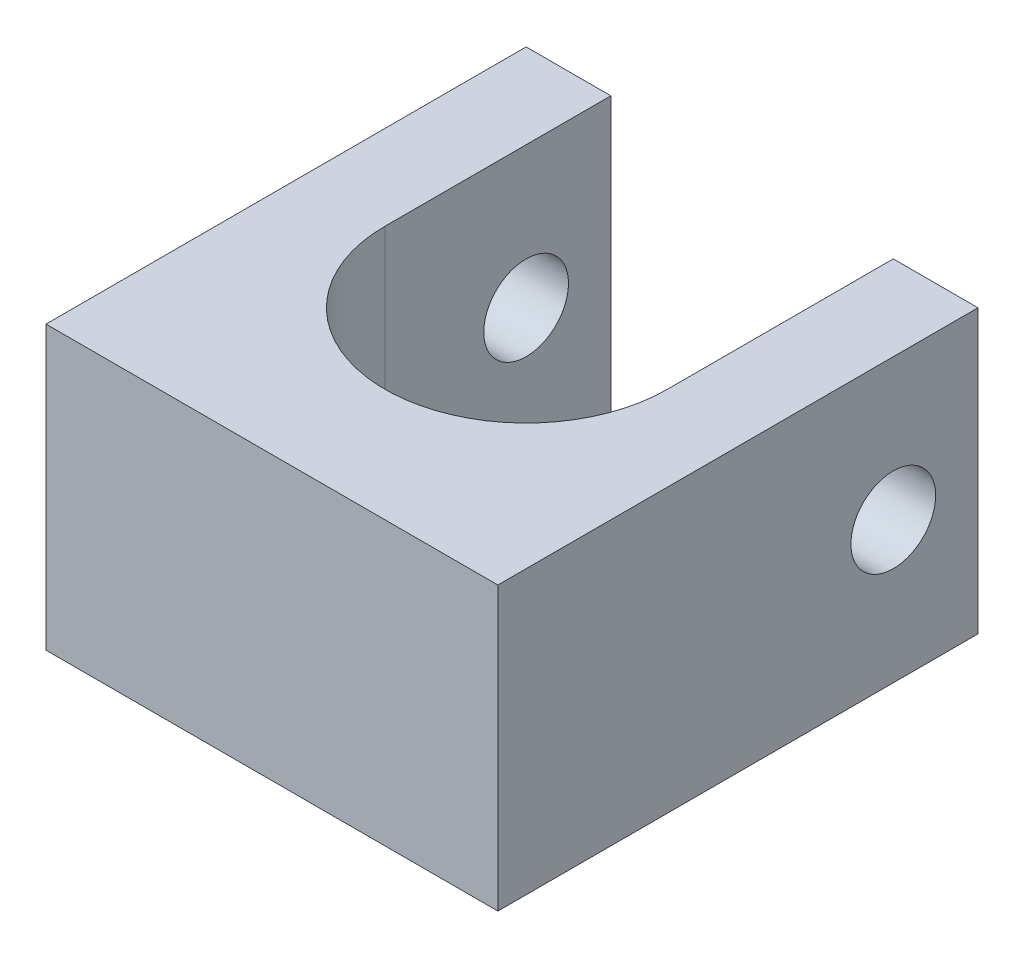
ISO-10303-21;
HEADER;
FILE_DESCRIPTION(('STEP AP214'),'2;1');
FILE_NAME('part.step','',(''),(''),'','','');
FILE_SCHEMA(('AUTOMOTIVE_DESIGN { 1 0 10303 214 1 1 1 1 }'));
ENDSEC;
DATA;
#1=APPLICATION_CONTEXT('core data for automotive mechanical design processes');
#2=APPLICATION_PROTOCOL_DEFINITION('international standard','automotive_design',2000,#1);
#3=PRODUCT_CONTEXT('',#1,'mechanical');
#4=PRODUCT('Part','Part','',(#3));
#5=PRODUCT_RELATED_PRODUCT_CATEGORY('part','',(#4));
#6=PRODUCT_DEFINITION_FORMATION('','',#4);
#7=PRODUCT_DEFINITION_CONTEXT('part definition',#1,'design');
#8=PRODUCT_DEFINITION('design','',#6,#7);
#9=PRODUCT_DEFINITION_SHAPE('','',#8);
#10=(LENGTH_UNIT() NAMED_UNIT(*) SI_UNIT(.MILLI.,.METRE.));
#11=(NAMED_UNIT(*) PLANE_ANGLE_UNIT() SI_UNIT($,.RADIAN.));
#12=(NAMED_UNIT(*) SI_UNIT($,.STERADIAN.) SOLID_ANGLE_UNIT());
#13=UNCERTAINTY_MEASURE_WITH_UNIT(LENGTH_MEASURE(1.E-05),#10,'distance_accuracy_value','');
#14=(GEOMETRIC_REPRESENTATION_CONTEXT(3) GLOBAL_UNCERTAINTY_ASSIGNED_CONTEXT((#13)) GLOBAL_UNIT_ASSIGNED_CONTEXT((#10,
#11,#12)) REPRESENTATION_CONTEXT('',''));
#15=CARTESIAN_POINT('',(0.,0.,0.));
#16=DIRECTION('',(0.,0.,1.));
#17=DIRECTION('',(1.,0.,0.));
#18=AXIS2_PLACEMENT_3D('',#15,#16,#17);
#19=CARTESIAN_POINT('',(0.,0.,0.));
#20=DIRECTION('',(0.,0.,-1.));
#21=DIRECTION('',(-1.,0.,0.));
#22=AXIS2_PLACEMENT_3D('',#19,#20,#21);
#23=PLANE('',#22);
#24=DIRECTION('',(0.,1.,0.));
#25=VECTOR('',#24,1.);
#26=CARTESIAN_POINT('',(-25.,0.,0.));
#27=LINE('',#26,#25);
#28=CARTESIAN_POINT('',(-25.,-25.,0.));
#29=VERTEX_POINT('',#28);
#30=CARTESIAN_POINT('',(-25.,25.,0.));
#31=VERTEX_POINT('',#30);
#32=EDGE_CURVE('E11',#29,#31,#27,.T.);
#33=ORIENTED_EDGE('',*,*,#32,.F.);
#34=DIRECTION('',(1.,0.,0.));
#35=VECTOR('',#34,1.);
#36=CARTESIAN_POINT('',(-40.,-25.,0.));
#37=LINE('',#36,#35);
#38=CARTESIAN_POINT('',(-40.,-25.,0.));
#39=VERTEX_POINT('',#38);
#40=EDGE_CURVE('E136',#39,#29,#37,.T.);
#41=ORIENTED_EDGE('',*,*,#40,.F.);
#42=DIRECTION('',(0.,-1.,0.));
#43=VECTOR('',#42,1.);
#44=CARTESIAN_POINT('',(-40.,-25.,0.));
#45=LINE('',#44,#43);
#46=CARTESIAN_POINT('',(-40.,25.,0.));
#47=VERTEX_POINT('',#46);
#48=EDGE_CURVE('E148',#47,#39,#45,.T.);
#49=ORIENTED_EDGE('',*,*,#48,.F.);
#50=DIRECTION('',(-1.,0.,0.));
#51=VECTOR('',#50,1.);
#52=CARTESIAN_POINT('',(-40.,25.,0.));
#53=LINE('',#52,#51);
#54=EDGE_CURVE('E144',#31,#47,#53,.T.);
#55=ORIENTED_EDGE('',*,*,#54,.F.);
#56=EDGE_LOOP('',(#33,#41,#49,#55));
#57=FACE_BOUND('',#56,.T.);
#58=ADVANCED_FACE('F33',(#57),#23,.T.);
#59=CARTESIAN_POINT('',(40.,-25.,85.));
#60=DIRECTION('',(-1.,0.,0.));
#61=DIRECTION('',(0.,0.,1.));
#62=AXIS2_PLACEMENT_3D('',#59,#60,#61);
#63=PLANE('',#62);
#64=CARTESIAN_POINT('',(40.,0.,15.));
#65=DIRECTION('',(1.,0.,0.));
#66=DIRECTION('',(0.,0.,-1.));
#67=AXIS2_PLACEMENT_3D('',#64,#65,#66);
#68=CIRCLE('',#67,7.5);
#69=CARTESIAN_POINT('',(40.,0.,7.5));
#70=VERTEX_POINT('',#69);
#71=EDGE_CURVE('E122',#70,#70,#68,.T.);
#72=ORIENTED_EDGE('',*,*,#71,.F.);
#73=EDGE_LOOP('',(#72));
#74=FACE_BOUND('',#73,.T.);
#75=DIRECTION('',(0.,1.,0.));
#76=VECTOR('',#75,1.);
#77=CARTESIAN_POINT('',(40.,-25.,0.));
#78=LINE('',#77,#76);
#79=CARTESIAN_POINT('',(40.,-25.,0.));
#80=VERTEX_POINT('',#79);
#81=CARTESIAN_POINT('',(40.,25.,0.));
#82=VERTEX_POINT('',#81);
#83=EDGE_CURVE('E133',#80,#82,#78,.T.);
#84=ORIENTED_EDGE('',*,*,#83,.T.);
#85=DIRECTION('',(0.,0.,-1.));
#86=VECTOR('',#85,1.);
#87=CARTESIAN_POINT('',(40.,25.,85.));
#88=LINE('',#87,#86);
#89=CARTESIAN_POINT('',(40.,25.,85.));
#90=VERTEX_POINT('',#89);
#91=EDGE_CURVE('E158',#90,#82,#88,.T.);
#92=ORIENTED_EDGE('',*,*,#91,.F.);
#93=DIRECTION('',(0.,1.,0.));
#94=VECTOR('',#93,1.);
#95=CARTESIAN_POINT('',(40.,-25.,85.));
#96=LINE('',#95,#94);
#97=CARTESIAN_POINT('',(40.,-25.,85.));
#98=VERTEX_POINT('',#97);
#99=EDGE_CURVE('E134',#98,#90,#96,.T.);
#100=ORIENTED_EDGE('',*,*,#99,.F.);
#101=DIRECTION('',(0.,0.,-1.));
#102=VECTOR('',#101,1.);
#103=CARTESIAN_POINT('',(40.,-25.,85.));
#104=LINE('',#103,#102);
#105=EDGE_CURVE('E141',#98,#80,#104,.T.);
#106=ORIENTED_EDGE('',*,*,#105,.T.);
#107=EDGE_LOOP('',(#84,#92,#100,#106));
#108=FACE_BOUND('',#107,.T.);
#109=ADVANCED_FACE('F35',(#74,#108),#63,.F.);
#110=CARTESIAN_POINT('',(-40.,25.,85.));
#111=DIRECTION('',(0.,-1.,0.));
#112=DIRECTION('',(0.,0.,-1.));
#113=AXIS2_PLACEMENT_3D('',#110,#111,#112);
#114=PLANE('',#113);
#115=DIRECTION('',(0.,0.,1.));
#116=VECTOR('',#115,1.);
#117=CARTESIAN_POINT('',(25.,25.,85.));
#118=LINE('',#117,#116);
#119=CARTESIAN_POINT('',(25.,25.,0.));
#120=VERTEX_POINT('',#119);
#121=CARTESIAN_POINT('',(25.,25.,40.));
#122=VERTEX_POINT('',#121);
#123=EDGE_CURVE('E49',#120,#122,#118,.T.);
#124=ORIENTED_EDGE('',*,*,#123,.T.);
#125=CARTESIAN_POINT('',(0.,25.,40.));
#126=DIRECTION('',(0.,1.,0.));
#127=DIRECTION('',(0.,0.,1.));
#128=AXIS2_PLACEMENT_3D('',#125,#126,#127);
#129=CIRCLE('',#128,25.);
#130=CARTESIAN_POINT('',(-25.,25.,40.));
#131=VERTEX_POINT('',#130);
#132=EDGE_CURVE('E113',#131,#122,#129,.T.);
#133=ORIENTED_EDGE('',*,*,#132,.F.);
#134=DIRECTION('',(0.,0.,-1.));
#135=VECTOR('',#134,1.);
#136=CARTESIAN_POINT('',(-25.,25.,85.));
#137=LINE('',#136,#135);
#138=EDGE_CURVE('E130',#131,#31,#137,.T.);
#139=ORIENTED_EDGE('',*,*,#138,.T.);
#140=ORIENTED_EDGE('',*,*,#54,.T.);
#141=DIRECTION('',(0.,0.,-1.));
#142=VECTOR('',#141,1.);
#143=CARTESIAN_POINT('',(-40.,25.,85.));
#144=LINE('',#143,#142);
#145=CARTESIAN_POINT('',(-40.,25.,85.));
#146=VERTEX_POINT('',#145);
#147=EDGE_CURVE('E155',#146,#47,#144,.T.);
#148=ORIENTED_EDGE('',*,*,#147,.F.);
#149=DIRECTION('',(-1.,0.,0.));
#150=VECTOR('',#149,1.);
#151=CARTESIAN_POINT('',(-40.,25.,85.));
#152=LINE('',#151,#150);
#153=EDGE_CURVE('E87',#90,#146,#152,.T.);
#154=ORIENTED_EDGE('',*,*,#153,.F.);
#155=ORIENTED_EDGE('',*,*,#91,.T.);
#156=EDGE_CURVE('E145',#82,#120,#53,.T.);
#157=ORIENTED_EDGE('',*,*,#156,.T.);
#158=EDGE_LOOP('',(#124,#133,#139,#140,#148,#154,#155,#157));
#159=FACE_BOUND('',#158,.T.);
#160=ADVANCED_FACE('F161',(#159),#114,.F.);
#161=CARTESIAN_POINT('',(-40.,-25.,85.));
#162=DIRECTION('',(1.,0.,0.));
#163=DIRECTION('',(0.,0.,-1.));
#164=AXIS2_PLACEMENT_3D('',#161,#162,#163);
#165=PLANE('',#164);
#166=CARTESIAN_POINT('',(-40.,0.,15.));
#167=DIRECTION('',(1.,0.,0.));
#168=DIRECTION('',(0.,0.,-1.));
#169=AXIS2_PLACEMENT_3D('',#166,#167,#168);
#170=CIRCLE('',#169,7.5);
#171=CARTESIAN_POINT('',(-40.,0.,7.5));
#172=VERTEX_POINT('',#171);
#173=EDGE_CURVE('E201',#172,#172,#170,.T.);
#174=ORIENTED_EDGE('',*,*,#173,.T.);
#175=EDGE_LOOP('',(#174));
#176=FACE_BOUND('',#175,.T.);
#177=ORIENTED_EDGE('',*,*,#48,.T.);
#178=DIRECTION('',(0.,0.,-1.));
#179=VECTOR('',#178,1.);
#180=CARTESIAN_POINT('',(-40.,-25.,85.));
#181=LINE('',#180,#179);
#182=CARTESIAN_POINT('',(-40.,-25.,85.));
#183=VERTEX_POINT('',#182);
#184=EDGE_CURVE('E152',#183,#39,#181,.T.);
#185=ORIENTED_EDGE('',*,*,#184,.F.);
#186=DIRECTION('',(0.,-1.,0.));
#187=VECTOR('',#186,1.);
#188=CARTESIAN_POINT('',(-40.,-25.,85.));
#189=LINE('',#188,#187);
#190=EDGE_CURVE('E138',#146,#183,#189,.T.);
#191=ORIENTED_EDGE('',*,*,#190,.F.);
#192=ORIENTED_EDGE('',*,*,#147,.T.);
#193=EDGE_LOOP('',(#177,#185,#191,#192));
#194=FACE_BOUND('',#193,.T.);
#195=ADVANCED_FACE('F194',(#176,#194),#165,.F.);
#196=CARTESIAN_POINT('',(-40.,-25.,85.));
#197=DIRECTION('',(0.,1.,0.));
#198=DIRECTION('',(0.,0.,1.));
#199=AXIS2_PLACEMENT_3D('',#196,#197,#198);
#200=PLANE('',#199);
#201=DIRECTION('',(0.,0.,1.));
#202=VECTOR('',#201,1.);
#203=CARTESIAN_POINT('',(-25.,-25.,85.));
#204=LINE('',#203,#202);
#205=CARTESIAN_POINT('',(-25.,-25.,40.));
#206=VERTEX_POINT('',#205);
#207=EDGE_CURVE('E121',#29,#206,#204,.T.);
#208=ORIENTED_EDGE('',*,*,#207,.T.);
#209=CARTESIAN_POINT('',(0.,-25.,40.));
#210=DIRECTION('',(0.,1.,0.));
#211=DIRECTION('',(0.,0.,1.));
#212=AXIS2_PLACEMENT_3D('',#209,#210,#211);
#213=CIRCLE('',#212,25.);
#214=CARTESIAN_POINT('',(25.,-25.,40.));
#215=VERTEX_POINT('',#214);
#216=EDGE_CURVE('E110',#206,#215,#213,.T.);
#217=ORIENTED_EDGE('',*,*,#216,.T.);
#218=DIRECTION('',(0.,0.,-1.));
#219=VECTOR('',#218,1.);
#220=CARTESIAN_POINT('',(25.,-25.,85.));
#221=LINE('',#220,#219);
#222=CARTESIAN_POINT('',(25.,-25.,0.));
#223=VERTEX_POINT('',#222);
#224=EDGE_CURVE('E115',#215,#223,#221,.T.);
#225=ORIENTED_EDGE('',*,*,#224,.T.);
#226=EDGE_CURVE('E79',#223,#80,#37,.T.);
#227=ORIENTED_EDGE('',*,*,#226,.T.);
#228=ORIENTED_EDGE('',*,*,#105,.F.);
#229=DIRECTION('',(1.,0.,0.));
#230=VECTOR('',#229,1.);
#231=CARTESIAN_POINT('',(-40.,-25.,85.));
#232=LINE('',#231,#230);
#233=EDGE_CURVE('E58',#183,#98,#232,.T.);
#234=ORIENTED_EDGE('',*,*,#233,.F.);
#235=ORIENTED_EDGE('',*,*,#184,.T.);
#236=ORIENTED_EDGE('',*,*,#40,.T.);
#237=EDGE_LOOP('',(#208,#217,#225,#227,#228,#234,#235,#236));
#238=FACE_BOUND('',#237,.T.);
#239=ADVANCED_FACE('F119',(#238),#200,.F.);
#240=CARTESIAN_POINT('',(0.,0.,85.));
#241=DIRECTION('',(0.,0.,-1.));
#242=DIRECTION('',(-1.,0.,0.));
#243=AXIS2_PLACEMENT_3D('',#240,#241,#242);
#244=PLANE('',#243);
#245=ORIENTED_EDGE('',*,*,#99,.T.);
#246=ORIENTED_EDGE('',*,*,#153,.T.);
#247=ORIENTED_EDGE('',*,*,#190,.T.);
#248=ORIENTED_EDGE('',*,*,#233,.T.);
#249=EDGE_LOOP('',(#245,#246,#247,#248));
#250=FACE_BOUND('',#249,.T.);
#251=ADVANCED_FACE('F169',(#250),#244,.F.);
#252=DIRECTION('',(0.,-1.,0.));
#253=VECTOR('',#252,1.);
#254=CARTESIAN_POINT('',(25.,0.,0.));
#255=LINE('',#254,#253);
#256=EDGE_CURVE('E42',#120,#223,#255,.T.);
#257=ORIENTED_EDGE('',*,*,#256,.F.);
#258=ORIENTED_EDGE('',*,*,#156,.F.);
#259=ORIENTED_EDGE('',*,*,#83,.F.);
#260=ORIENTED_EDGE('',*,*,#226,.F.);
#261=EDGE_LOOP('',(#257,#258,#259,#260));
#262=FACE_BOUND('',#261,.T.);
#263=ADVANCED_FACE('F166',(#262),#23,.T.);
#264=CARTESIAN_POINT('',(-25.,-27.6448497514331,40.));
#265=DIRECTION('',(-1.,0.,0.));
#266=DIRECTION('',(0.,0.,1.));
#267=AXIS2_PLACEMENT_3D('',#264,#265,#266);
#268=PLANE('',#267);
#269=CARTESIAN_POINT('',(-25.,0.,15.));
#270=DIRECTION('',(-1.,0.,0.));
#271=DIRECTION('',(0.,0.,1.));
#272=AXIS2_PLACEMENT_3D('',#269,#270,#271);
#273=CIRCLE('',#272,7.5);
#274=CARTESIAN_POINT('',(-25.,0.,22.5));
#275=VERTEX_POINT('',#274);
#276=EDGE_CURVE('E195',#275,#275,#273,.T.);
#277=ORIENTED_EDGE('',*,*,#276,.T.);
#278=EDGE_LOOP('',(#277));
#279=FACE_BOUND('',#278,.T.);
#280=DIRECTION('',(0.,1.,0.));
#281=VECTOR('',#280,1.);
#282=CARTESIAN_POINT('',(-25.,-27.6448497514331,40.));
#283=LINE('',#282,#281);
#284=EDGE_CURVE('E116',#206,#131,#283,.T.);
#285=ORIENTED_EDGE('',*,*,#284,.F.);
#286=ORIENTED_EDGE('',*,*,#207,.F.);
#287=ORIENTED_EDGE('',*,*,#32,.T.);
#288=ORIENTED_EDGE('',*,*,#138,.F.);
#289=EDGE_LOOP('',(#285,#286,#287,#288));
#290=FACE_BOUND('',#289,.T.);
#291=ADVANCED_FACE('F168',(#279,#290),#268,.F.);
#292=CARTESIAN_POINT('',(25.,-27.6448497514331,40.));
#293=DIRECTION('',(1.,0.,0.));
#294=DIRECTION('',(0.,1.,0.));
#295=AXIS2_PLACEMENT_3D('',#292,#293,#294);
#296=PLANE('',#295);
#297=CARTESIAN_POINT('',(25.,0.,15.));
#298=DIRECTION('',(1.,0.,0.));
#299=DIRECTION('',(0.,1.,0.));
#300=AXIS2_PLACEMENT_3D('',#297,#298,#299);
#301=CIRCLE('',#300,7.5);
#302=CARTESIAN_POINT('',(25.,7.5,15.));
#303=VERTEX_POINT('',#302);
#304=EDGE_CURVE('E37',#303,#303,#301,.T.);
#305=ORIENTED_EDGE('',*,*,#304,.T.);
#306=EDGE_LOOP('',(#305));
#307=FACE_BOUND('',#306,.T.);
#308=ORIENTED_EDGE('',*,*,#256,.T.);
#309=ORIENTED_EDGE('',*,*,#224,.F.);
#310=DIRECTION('',(0.,-1.,0.));
#311=VECTOR('',#310,1.);
#312=CARTESIAN_POINT('',(25.,-27.6448497514331,40.));
#313=LINE('',#312,#311);
#314=EDGE_CURVE('E107',#122,#215,#313,.T.);
#315=ORIENTED_EDGE('',*,*,#314,.F.);
#316=ORIENTED_EDGE('',*,*,#123,.F.);
#317=EDGE_LOOP('',(#308,#309,#315,#316));
#318=FACE_BOUND('',#317,.T.);
#319=ADVANCED_FACE('F124',(#307,#318),#296,.F.);
#320=CARTESIAN_POINT('',(-40.,0.,15.));
#321=DIRECTION('',(1.,0.,0.));
#322=DIRECTION('',(0.,0.,-1.));
#323=AXIS2_PLACEMENT_3D('',#320,#321,#322);
#324=CYLINDRICAL_SURFACE('',#323,7.5);
#325=ORIENTED_EDGE('',*,*,#71,.T.);
#326=EDGE_LOOP('',(#325));
#327=FACE_BOUND('',#326,.T.);
#328=ORIENTED_EDGE('',*,*,#304,.F.);
#329=EDGE_LOOP('',(#328));
#330=FACE_BOUND('',#329,.T.);
#331=ADVANCED_FACE('F210',(#327,#330),#324,.F.);
#332=ORIENTED_EDGE('',*,*,#173,.F.);
#333=EDGE_LOOP('',(#332));
#334=FACE_BOUND('',#333,.T.);
#335=ORIENTED_EDGE('',*,*,#276,.F.);
#336=EDGE_LOOP('',(#335));
#337=FACE_BOUND('',#336,.T.);
#338=ADVANCED_FACE('F212',(#334,#337),#324,.F.);
#339=CARTESIAN_POINT('',(0.,-25.,40.));
#340=DIRECTION('',(0.,1.,0.));
#341=DIRECTION('',(0.,0.,1.));
#342=AXIS2_PLACEMENT_3D('',#339,#340,#341);
#343=CYLINDRICAL_SURFACE('',#342,25.);
#344=ORIENTED_EDGE('',*,*,#132,.T.);
#345=ORIENTED_EDGE('',*,*,#314,.T.);
#346=ORIENTED_EDGE('',*,*,#216,.F.);
#347=ORIENTED_EDGE('',*,*,#284,.T.);
#348=EDGE_LOOP('',(#344,#345,#346,#347));
#349=FACE_BOUND('',#348,.T.);
#350=ADVANCED_FACE('F109',(#349),#343,.F.);
#351=CLOSED_SHELL('',(#58,#109,#160,#195,#239,#251,#263,#291,#319,#331,#338,#350));
#352=MANIFOLD_SOLID_BREP('B2',#351);
#353=ADVANCED_BREP_SHAPE_REPRESENTATION('',(#18,#352),#14);
#354=SHAPE_DEFINITION_REPRESENTATION(#9,#353);
ENDSEC;
END-ISO-10303-21;
